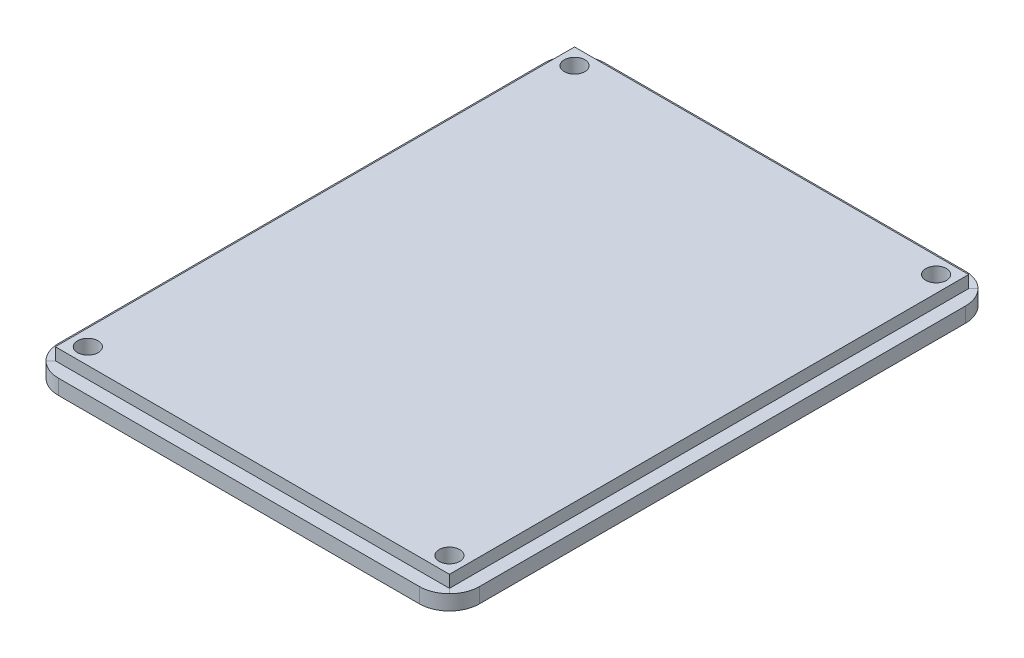
ISO-10303-21;
HEADER;
FILE_DESCRIPTION(('STEP AP214'),'2;1');
FILE_NAME('part.step','',(''),(''),'','','');
FILE_SCHEMA(('AUTOMOTIVE_DESIGN { 1 0 10303 214 1 1 1 1 }'));
ENDSEC;
DATA;
#1=APPLICATION_CONTEXT('core data for automotive mechanical design processes');
#2=APPLICATION_PROTOCOL_DEFINITION('international standard','automotive_design',2000,#1);
#3=PRODUCT_CONTEXT('',#1,'mechanical');
#4=PRODUCT('Part','Part','',(#3));
#5=PRODUCT_RELATED_PRODUCT_CATEGORY('part','',(#4));
#6=PRODUCT_DEFINITION_FORMATION('','',#4);
#7=PRODUCT_DEFINITION_CONTEXT('part definition',#1,'design');
#8=PRODUCT_DEFINITION('design','',#6,#7);
#9=PRODUCT_DEFINITION_SHAPE('','',#8);
#10=(LENGTH_UNIT() NAMED_UNIT(*) SI_UNIT(.MILLI.,.METRE.));
#11=(NAMED_UNIT(*) PLANE_ANGLE_UNIT() SI_UNIT($,.RADIAN.));
#12=(NAMED_UNIT(*) SI_UNIT($,.STERADIAN.) SOLID_ANGLE_UNIT());
#13=UNCERTAINTY_MEASURE_WITH_UNIT(LENGTH_MEASURE(1.E-05),#10,'distance_accuracy_value','');
#14=(GEOMETRIC_REPRESENTATION_CONTEXT(3) GLOBAL_UNCERTAINTY_ASSIGNED_CONTEXT((#13)) GLOBAL_UNIT_ASSIGNED_CONTEXT((#10,
#11,#12)) REPRESENTATION_CONTEXT('',''));
#15=CARTESIAN_POINT('',(0.,0.,0.));
#16=DIRECTION('',(0.,0.,1.));
#17=DIRECTION('',(1.,0.,0.));
#18=AXIS2_PLACEMENT_3D('',#15,#16,#17);
#19=CARTESIAN_POINT('',(34.115,-9.09999999999999,41.5));
#20=DIRECTION('',(0.,-1.,0.));
#21=DIRECTION('',(0.,0.,-1.));
#22=AXIS2_PLACEMENT_3D('',#19,#20,#21);
#23=PLANE('',#22);
#24=CARTESIAN_POINT('',(-28.8499999999999,-9.09999999999999,38.85));
#25=DIRECTION('',(0.,-1.,0.));
#26=DIRECTION('',(0.,0.,-1.));
#27=AXIS2_PLACEMENT_3D('',#24,#25,#26);
#28=CIRCLE('',#27,4.8);
#29=CARTESIAN_POINT('',(-28.8499999999999,-9.09999999999999,43.65));
#30=VERTEX_POINT('',#29);
#31=CARTESIAN_POINT('',(-32.2441125496954,-9.09999999999999,42.2441125496954));
#32=VERTEX_POINT('',#31);
#33=EDGE_CURVE('E332',#30,#32,#28,.T.);
#34=ORIENTED_EDGE('',*,*,#33,.F.);
#35=DIRECTION('',(-1.,0.,0.));
#36=VECTOR('',#35,1.);
#37=CARTESIAN_POINT('',(34.115,-9.09999999999999,43.65));
#38=LINE('',#37,#36);
#39=CARTESIAN_POINT('',(28.85,-9.09999999999999,43.65));
#40=VERTEX_POINT('',#39);
#41=EDGE_CURVE('E231',#40,#30,#38,.T.);
#42=ORIENTED_EDGE('',*,*,#41,.F.);
#43=CARTESIAN_POINT('',(28.85,-9.09999999999999,38.85));
#44=DIRECTION('',(0.,-1.,0.));
#45=DIRECTION('',(0.,0.,-1.));
#46=AXIS2_PLACEMENT_3D('',#43,#44,#45);
#47=CIRCLE('',#46,4.8);
#48=CARTESIAN_POINT('',(32.2441125496954,-9.09999999999999,42.2441125496954));
#49=VERTEX_POINT('',#48);
#50=EDGE_CURVE('E339',#49,#40,#47,.T.);
#51=ORIENTED_EDGE('',*,*,#50,.F.);
#52=DIRECTION('',(-0.707106781186548,0.,-0.707106781186548));
#53=VECTOR('',#52,1.);
#54=CARTESIAN_POINT('',(-11.3075,-9.09999999999999,-1.30749999999999));
#55=LINE('',#54,#53);
#56=CARTESIAN_POINT('',(31.5,-9.09999999999999,41.5));
#57=VERTEX_POINT('',#56);
#58=EDGE_CURVE('E378',#49,#57,#55,.T.);
#59=ORIENTED_EDGE('',*,*,#58,.T.);
#60=DIRECTION('',(-1.,0.,0.));
#61=VECTOR('',#60,1.);
#62=CARTESIAN_POINT('',(34.115,-9.09999999999999,41.5));
#63=LINE('',#62,#61);
#64=CARTESIAN_POINT('',(-31.5,-9.09999999999999,41.5));
#65=VERTEX_POINT('',#64);
#66=EDGE_CURVE('E243',#57,#65,#63,.T.);
#67=ORIENTED_EDGE('',*,*,#66,.T.);
#68=DIRECTION('',(0.707106781186547,0.,-0.707106781186548));
#69=VECTOR('',#68,1.);
#70=CARTESIAN_POINT('',(-32.8075,-9.09999999999999,42.8075));
#71=LINE('',#70,#69);
#72=EDGE_CURVE('E301',#32,#65,#71,.T.);
#73=ORIENTED_EDGE('',*,*,#72,.F.);
#74=EDGE_LOOP('',(#34,#42,#51,#59,#67,#73));
#75=FACE_BOUND('',#74,.T.);
#76=ADVANCED_FACE('F43',(#75),#23,.F.);
#77=CARTESIAN_POINT('',(34.115,-9.09999999999999,43.65));
#78=DIRECTION('',(0.,0.,-1.));
#79=DIRECTION('',(-1.,0.,0.));
#80=AXIS2_PLACEMENT_3D('',#77,#78,#79);
#81=PLANE('',#80);
#82=DIRECTION('',(0.,1.,0.));
#83=VECTOR('',#82,1.);
#84=CARTESIAN_POINT('',(-28.8499999999999,-11.5,43.65));
#85=LINE('',#84,#83);
#86=CARTESIAN_POINT('',(-28.8499999999999,-11.5,43.65));
#87=VERTEX_POINT('',#86);
#88=EDGE_CURVE('E214',#87,#30,#85,.T.);
#89=ORIENTED_EDGE('',*,*,#88,.F.);
#90=DIRECTION('',(-1.,0.,0.));
#91=VECTOR('',#90,1.);
#92=CARTESIAN_POINT('',(34.115,-11.5,43.65));
#93=LINE('',#92,#91);
#94=CARTESIAN_POINT('',(28.85,-11.5,43.65));
#95=VERTEX_POINT('',#94);
#96=EDGE_CURVE('E227',#95,#87,#93,.T.);
#97=ORIENTED_EDGE('',*,*,#96,.F.);
#98=DIRECTION('',(0.,1.,0.));
#99=VECTOR('',#98,1.);
#100=CARTESIAN_POINT('',(28.85,-11.5,43.65));
#101=LINE('',#100,#99);
#102=EDGE_CURVE('E235',#95,#40,#101,.T.);
#103=ORIENTED_EDGE('',*,*,#102,.T.);
#104=ORIENTED_EDGE('',*,*,#41,.T.);
#105=EDGE_LOOP('',(#89,#97,#103,#104));
#106=FACE_BOUND('',#105,.T.);
#107=ADVANCED_FACE('F230',(#106),#81,.F.);
#108=CARTESIAN_POINT('',(-31.5,-9.09999999999999,44.115));
#109=DIRECTION('',(0.,-1.,0.));
#110=DIRECTION('',(0.,0.,-1.));
#111=AXIS2_PLACEMENT_3D('',#108,#109,#110);
#112=PLANE('',#111);
#113=CARTESIAN_POINT('',(-28.8499999999999,-9.09999999999999,38.85));
#114=DIRECTION('',(0.,-1.,0.));
#115=DIRECTION('',(0.,0.,-1.));
#116=AXIS2_PLACEMENT_3D('',#113,#114,#115);
#117=CIRCLE('',#116,4.8);
#118=CARTESIAN_POINT('',(-33.6499999999999,-9.09999999999999,38.85));
#119=VERTEX_POINT('',#118);
#120=EDGE_CURVE('E337',#32,#119,#117,.T.);
#121=ORIENTED_EDGE('',*,*,#120,.F.);
#122=ORIENTED_EDGE('',*,*,#72,.T.);
#123=DIRECTION('',(0.,0.,-1.));
#124=VECTOR('',#123,1.);
#125=CARTESIAN_POINT('',(-31.5,-9.09999999999999,44.115));
#126=LINE('',#125,#124);
#127=CARTESIAN_POINT('',(-31.5,-9.09999999999999,0.));
#128=VERTEX_POINT('',#127);
#129=EDGE_CURVE('E315',#65,#128,#126,.T.);
#130=ORIENTED_EDGE('',*,*,#129,.T.);
#131=DIRECTION('',(-1.,0.,0.));
#132=VECTOR('',#131,1.);
#133=CARTESIAN_POINT('',(-31.5,-9.09999999999999,0.));
#134=LINE('',#133,#132);
#135=CARTESIAN_POINT('',(-33.65,-9.09999999999999,0.));
#136=VERTEX_POINT('',#135);
#137=EDGE_CURVE('E320',#128,#136,#134,.T.);
#138=ORIENTED_EDGE('',*,*,#137,.T.);
#139=DIRECTION('',(0.,0.,-1.));
#140=VECTOR('',#139,1.);
#141=CARTESIAN_POINT('',(-33.65,-9.09999999999999,44.115));
#142=LINE('',#141,#140);
#143=EDGE_CURVE('E244',#119,#136,#142,.T.);
#144=ORIENTED_EDGE('',*,*,#143,.F.);
#145=EDGE_LOOP('',(#121,#122,#130,#138,#144));
#146=FACE_BOUND('',#145,.T.);
#147=ADVANCED_FACE('F399',(#146),#112,.F.);
#148=CARTESIAN_POINT('',(-31.5,-9.09999999999999,0.));
#149=DIRECTION('',(0.,-1.,0.));
#150=DIRECTION('',(0.,0.,-1.));
#151=AXIS2_PLACEMENT_3D('',#148,#149,#150);
#152=PLANE('',#151);
#153=CARTESIAN_POINT('',(-28.85,-9.09999999999999,-38.85));
#154=DIRECTION('',(0.,-1.,0.));
#155=DIRECTION('',(0.,0.,-1.));
#156=AXIS2_PLACEMENT_3D('',#153,#154,#155);
#157=CIRCLE('',#156,4.79999999999999);
#158=CARTESIAN_POINT('',(-33.6499999999999,-9.09999999999999,-38.85));
#159=VERTEX_POINT('',#158);
#160=CARTESIAN_POINT('',(-32.2441125496954,-9.09999999999999,-42.2441125496954));
#161=VERTEX_POINT('',#160);
#162=EDGE_CURVE('E702',#159,#161,#157,.T.);
#163=ORIENTED_EDGE('',*,*,#162,.F.);
#164=DIRECTION('',(0.,0.,-1.));
#165=VECTOR('',#164,1.);
#166=CARTESIAN_POINT('',(-33.65,-9.09999999999999,0.));
#167=LINE('',#166,#165);
#168=EDGE_CURVE('E319',#136,#159,#167,.T.);
#169=ORIENTED_EDGE('',*,*,#168,.F.);
#170=ORIENTED_EDGE('',*,*,#137,.F.);
#171=DIRECTION('',(0.,0.,-1.));
#172=VECTOR('',#171,1.);
#173=CARTESIAN_POINT('',(-31.5,-9.09999999999999,0.));
#174=LINE('',#173,#172);
#175=CARTESIAN_POINT('',(-31.5,-9.09999999999999,-41.5));
#176=VERTEX_POINT('',#175);
#177=EDGE_CURVE('E304',#128,#176,#174,.T.);
#178=ORIENTED_EDGE('',*,*,#177,.T.);
#179=DIRECTION('',(0.707106781186548,0.,0.707106781186548));
#180=VECTOR('',#179,1.);
#181=CARTESIAN_POINT('',(-32.8075,-9.09999999999999,-42.8075));
#182=LINE('',#181,#180);
#183=EDGE_CURVE('E358',#161,#176,#182,.T.);
#184=ORIENTED_EDGE('',*,*,#183,.F.);
#185=EDGE_LOOP('',(#163,#169,#170,#178,#184));
#186=FACE_BOUND('',#185,.T.);
#187=ADVANCED_FACE('F605',(#186),#152,.F.);
#188=CARTESIAN_POINT('',(31.5,-9.09999999999999,-44.115));
#189=DIRECTION('',(0.,-1.,0.));
#190=DIRECTION('',(0.,0.,-1.));
#191=AXIS2_PLACEMENT_3D('',#188,#189,#190);
#192=PLANE('',#191);
#193=CARTESIAN_POINT('',(28.85,-9.09999999999999,-38.85));
#194=DIRECTION('',(0.,-1.,0.));
#195=DIRECTION('',(0.,0.,-1.));
#196=AXIS2_PLACEMENT_3D('',#193,#194,#195);
#197=CIRCLE('',#196,4.8);
#198=CARTESIAN_POINT('',(32.2441125496954,-9.09999999999999,-42.2441125496954));
#199=VERTEX_POINT('',#198);
#200=CARTESIAN_POINT('',(33.65,-9.09999999999999,-38.85));
#201=VERTEX_POINT('',#200);
#202=EDGE_CURVE('E715',#199,#201,#197,.T.);
#203=ORIENTED_EDGE('',*,*,#202,.F.);
#204=DIRECTION('',(-0.707106781186547,0.,0.707106781186548));
#205=VECTOR('',#204,1.);
#206=CARTESIAN_POINT('',(-1.30749999999997,-9.09999999999999,-8.69250000000001));
#207=LINE('',#206,#205);
#208=CARTESIAN_POINT('',(31.5,-9.09999999999999,-41.5));
#209=VERTEX_POINT('',#208);
#210=EDGE_CURVE('E345',#199,#209,#207,.T.);
#211=ORIENTED_EDGE('',*,*,#210,.T.);
#212=DIRECTION('',(0.,0.,1.));
#213=VECTOR('',#212,1.);
#214=CARTESIAN_POINT('',(31.5,-9.09999999999999,-44.115));
#215=LINE('',#214,#213);
#216=EDGE_CURVE('E381',#209,#57,#215,.T.);
#217=ORIENTED_EDGE('',*,*,#216,.T.);
#218=ORIENTED_EDGE('',*,*,#58,.F.);
#219=CARTESIAN_POINT('',(28.85,-9.09999999999999,38.85));
#220=DIRECTION('',(0.,-1.,0.));
#221=DIRECTION('',(0.,0.,-1.));
#222=AXIS2_PLACEMENT_3D('',#219,#220,#221);
#223=CIRCLE('',#222,4.8);
#224=CARTESIAN_POINT('',(33.65,-9.09999999999999,38.85));
#225=VERTEX_POINT('',#224);
#226=EDGE_CURVE('E410',#225,#49,#223,.T.);
#227=ORIENTED_EDGE('',*,*,#226,.F.);
#228=DIRECTION('',(0.,0.,1.));
#229=VECTOR('',#228,1.);
#230=CARTESIAN_POINT('',(33.65,-9.09999999999999,-44.115));
#231=LINE('',#230,#229);
#232=EDGE_CURVE('E385',#201,#225,#231,.T.);
#233=ORIENTED_EDGE('',*,*,#232,.F.);
#234=EDGE_LOOP('',(#203,#211,#217,#218,#227,#233));
#235=FACE_BOUND('',#234,.T.);
#236=ADVANCED_FACE('F411',(#235),#192,.F.);
#237=CARTESIAN_POINT('',(33.65,-9.09999999999999,-44.115));
#238=DIRECTION('',(-1.,0.,0.));
#239=DIRECTION('',(0.,0.,1.));
#240=AXIS2_PLACEMENT_3D('',#237,#238,#239);
#241=PLANE('',#240);
#242=DIRECTION('',(0.,1.,0.));
#243=VECTOR('',#242,1.);
#244=CARTESIAN_POINT('',(33.65,-11.5,38.85));
#245=LINE('',#244,#243);
#246=CARTESIAN_POINT('',(33.65,-11.5,38.85));
#247=VERTEX_POINT('',#246);
#248=EDGE_CURVE('E726',#247,#225,#245,.T.);
#249=ORIENTED_EDGE('',*,*,#248,.F.);
#250=DIRECTION('',(0.,0.,1.));
#251=VECTOR('',#250,1.);
#252=CARTESIAN_POINT('',(33.65,-11.5,-44.115));
#253=LINE('',#252,#251);
#254=CARTESIAN_POINT('',(33.65,-11.5,-38.85));
#255=VERTEX_POINT('',#254);
#256=EDGE_CURVE('E386',#255,#247,#253,.T.);
#257=ORIENTED_EDGE('',*,*,#256,.F.);
#258=DIRECTION('',(0.,1.,0.));
#259=VECTOR('',#258,1.);
#260=CARTESIAN_POINT('',(33.65,-11.5,-38.85));
#261=LINE('',#260,#259);
#262=EDGE_CURVE('E723',#255,#201,#261,.T.);
#263=ORIENTED_EDGE('',*,*,#262,.T.);
#264=ORIENTED_EDGE('',*,*,#232,.T.);
#265=EDGE_LOOP('',(#249,#257,#263,#264));
#266=FACE_BOUND('',#265,.T.);
#267=ADVANCED_FACE('F584',(#266),#241,.F.);
#268=CARTESIAN_POINT('',(-34.115,-9.09999999999999,-41.5));
#269=DIRECTION('',(0.,-1.,0.));
#270=DIRECTION('',(0.,0.,-1.));
#271=AXIS2_PLACEMENT_3D('',#268,#269,#270);
#272=PLANE('',#271);
#273=CARTESIAN_POINT('',(-28.85,-9.09999999999999,-38.85));
#274=DIRECTION('',(0.,-1.,0.));
#275=DIRECTION('',(0.,0.,-1.));
#276=AXIS2_PLACEMENT_3D('',#273,#274,#275);
#277=CIRCLE('',#276,4.79999999999999);
#278=CARTESIAN_POINT('',(-28.85,-9.09999999999999,-43.6499999999999));
#279=VERTEX_POINT('',#278);
#280=EDGE_CURVE('E704',#161,#279,#277,.T.);
#281=ORIENTED_EDGE('',*,*,#280,.F.);
#282=ORIENTED_EDGE('',*,*,#183,.T.);
#283=DIRECTION('',(1.,0.,0.));
#284=VECTOR('',#283,1.);
#285=CARTESIAN_POINT('',(-34.115,-9.09999999999999,-41.5));
#286=LINE('',#285,#284);
#287=EDGE_CURVE('E343',#176,#209,#286,.T.);
#288=ORIENTED_EDGE('',*,*,#287,.T.);
#289=ORIENTED_EDGE('',*,*,#210,.F.);
#290=CARTESIAN_POINT('',(28.85,-9.09999999999999,-38.85));
#291=DIRECTION('',(0.,-1.,0.));
#292=DIRECTION('',(0.,0.,-1.));
#293=AXIS2_PLACEMENT_3D('',#290,#291,#292);
#294=CIRCLE('',#293,4.8);
#295=CARTESIAN_POINT('',(28.85,-9.09999999999999,-43.65));
#296=VERTEX_POINT('',#295);
#297=EDGE_CURVE('E709',#296,#199,#294,.T.);
#298=ORIENTED_EDGE('',*,*,#297,.F.);
#299=DIRECTION('',(1.,0.,0.));
#300=VECTOR('',#299,1.);
#301=CARTESIAN_POINT('',(-34.115,-9.09999999999999,-43.65));
#302=LINE('',#301,#300);
#303=EDGE_CURVE('E262',#279,#296,#302,.T.);
#304=ORIENTED_EDGE('',*,*,#303,.F.);
#305=EDGE_LOOP('',(#281,#282,#288,#289,#298,#304));
#306=FACE_BOUND('',#305,.T.);
#307=ADVANCED_FACE('F422',(#306),#272,.F.);
#308=CARTESIAN_POINT('',(-34.115,-11.5,-43.65));
#309=DIRECTION('',(0.,1.,0.));
#310=DIRECTION('',(0.,0.,1.));
#311=AXIS2_PLACEMENT_3D('',#308,#309,#310);
#312=PLANE('',#311);
#313=DIRECTION('',(0.,0.,-1.));
#314=VECTOR('',#313,1.);
#315=CARTESIAN_POINT('',(-33.65,-11.5,0.));
#316=LINE('',#315,#314);
#317=CARTESIAN_POINT('',(-33.65,-11.5,0.));
#318=VERTEX_POINT('',#317);
#319=CARTESIAN_POINT('',(-33.6499999999999,-11.5,-38.85));
#320=VERTEX_POINT('',#319);
#321=EDGE_CURVE('E322',#318,#320,#316,.T.);
#322=ORIENTED_EDGE('',*,*,#321,.T.);
#323=CARTESIAN_POINT('',(-28.85,-11.5,-38.85));
#324=DIRECTION('',(0.,1.,0.));
#325=DIRECTION('',(0.,0.,1.));
#326=AXIS2_PLACEMENT_3D('',#323,#324,#325);
#327=CIRCLE('',#326,4.79999999999999);
#328=CARTESIAN_POINT('',(-32.2441125496954,-11.5,-42.2441125496954));
#329=VERTEX_POINT('',#328);
#330=EDGE_CURVE('E742',#329,#320,#327,.T.);
#331=ORIENTED_EDGE('',*,*,#330,.F.);
#332=CARTESIAN_POINT('',(-28.85,-11.5,-43.6499999999999));
#333=VERTEX_POINT('',#332);
#334=EDGE_CURVE('E232',#333,#329,#327,.T.);
#335=ORIENTED_EDGE('',*,*,#334,.F.);
#336=DIRECTION('',(1.,0.,0.));
#337=VECTOR('',#336,1.);
#338=CARTESIAN_POINT('',(-34.115,-11.5,-43.65));
#339=LINE('',#338,#337);
#340=CARTESIAN_POINT('',(28.85,-11.5,-43.6499999999999));
#341=VERTEX_POINT('',#340);
#342=EDGE_CURVE('E367',#333,#341,#339,.T.);
#343=ORIENTED_EDGE('',*,*,#342,.T.);
#344=CARTESIAN_POINT('',(28.85,-11.5,-38.85));
#345=DIRECTION('',(0.,1.,0.));
#346=DIRECTION('',(0.,0.,-1.));
#347=AXIS2_PLACEMENT_3D('',#344,#345,#346);
#348=CIRCLE('',#347,4.8);
#349=CARTESIAN_POINT('',(32.2441125496954,-11.5,-42.2441125496954));
#350=VERTEX_POINT('',#349);
#351=EDGE_CURVE('E745',#350,#341,#348,.T.);
#352=ORIENTED_EDGE('',*,*,#351,.F.);
#353=EDGE_CURVE('E740',#255,#350,#348,.T.);
#354=ORIENTED_EDGE('',*,*,#353,.F.);
#355=ORIENTED_EDGE('',*,*,#256,.T.);
#356=CARTESIAN_POINT('',(28.85,-11.5,38.85));
#357=DIRECTION('',(0.,1.,0.));
#358=DIRECTION('',(0.,0.,1.));
#359=AXIS2_PLACEMENT_3D('',#356,#357,#358);
#360=CIRCLE('',#359,4.8);
#361=CARTESIAN_POINT('',(32.2441125496954,-11.5,42.2441125496954));
#362=VERTEX_POINT('',#361);
#363=EDGE_CURVE('E734',#362,#247,#360,.T.);
#364=ORIENTED_EDGE('',*,*,#363,.F.);
#365=EDGE_CURVE('E236',#95,#362,#360,.T.);
#366=ORIENTED_EDGE('',*,*,#365,.F.);
#367=ORIENTED_EDGE('',*,*,#96,.T.);
#368=CARTESIAN_POINT('',(-28.8499999999999,-11.5,38.85));
#369=DIRECTION('',(0.,1.,0.));
#370=DIRECTION('',(0.,0.,1.));
#371=AXIS2_PLACEMENT_3D('',#368,#369,#370);
#372=CIRCLE('',#371,4.8);
#373=CARTESIAN_POINT('',(-32.2441125496954,-11.5,42.2441125496954));
#374=VERTEX_POINT('',#373);
#375=EDGE_CURVE('E212',#374,#87,#372,.T.);
#376=ORIENTED_EDGE('',*,*,#375,.F.);
#377=CARTESIAN_POINT('',(-33.6499999999999,-11.5,38.85));
#378=VERTEX_POINT('',#377);
#379=EDGE_CURVE('E216',#378,#374,#372,.T.);
#380=ORIENTED_EDGE('',*,*,#379,.F.);
#381=DIRECTION('',(0.,0.,-1.));
#382=VECTOR('',#381,1.);
#383=CARTESIAN_POINT('',(-33.65,-11.5,44.115));
#384=LINE('',#383,#382);
#385=EDGE_CURVE('E394',#378,#318,#384,.T.);
#386=ORIENTED_EDGE('',*,*,#385,.T.);
#387=EDGE_LOOP('',(#322,#331,#335,#343,#352,#354,#355,#364,#366,#367,#376,#380,#386));
#388=FACE_BOUND('',#387,.T.);
#389=CARTESIAN_POINT('',(-28.9,-11.5,38.9));
#390=DIRECTION('',(0.,1.,0.));
#391=DIRECTION('',(0.,0.,1.));
#392=AXIS2_PLACEMENT_3D('',#389,#390,#391);
#393=CIRCLE('',#392,3.65000000000003);
#394=CARTESIAN_POINT('',(-31.4809397513309,-11.5,41.4809397513309));
#395=VERTEX_POINT('',#394);
#396=EDGE_CURVE('E263',#395,#395,#393,.T.);
#397=ORIENTED_EDGE('',*,*,#396,.T.);
#398=EDGE_LOOP('',(#397));
#399=FACE_BOUND('',#398,.T.);
#400=CARTESIAN_POINT('',(28.9,-11.5,38.9));
#401=DIRECTION('',(0.,1.,0.));
#402=DIRECTION('',(0.,0.,1.));
#403=AXIS2_PLACEMENT_3D('',#400,#401,#402);
#404=CIRCLE('',#403,3.65);
#405=CARTESIAN_POINT('',(31.4809397513309,-11.5,41.4809397513309));
#406=VERTEX_POINT('',#405);
#407=EDGE_CURVE('E264',#406,#406,#404,.T.);
#408=ORIENTED_EDGE('',*,*,#407,.T.);
#409=EDGE_LOOP('',(#408));
#410=FACE_BOUND('',#409,.T.);
#411=CARTESIAN_POINT('',(28.9,-11.5,-38.9));
#412=DIRECTION('',(0.,1.,0.));
#413=DIRECTION('',(0.,0.,1.));
#414=AXIS2_PLACEMENT_3D('',#411,#412,#413);
#415=CIRCLE('',#414,3.65);
#416=CARTESIAN_POINT('',(31.4809397513309,-11.5,-41.4809397513309));
#417=VERTEX_POINT('',#416);
#418=EDGE_CURVE('E268',#417,#417,#415,.T.);
#419=ORIENTED_EDGE('',*,*,#418,.T.);
#420=EDGE_LOOP('',(#419));
#421=FACE_BOUND('',#420,.T.);
#422=CARTESIAN_POINT('',(-28.9,-11.5,-38.9));
#423=DIRECTION('',(0.,1.,0.));
#424=DIRECTION('',(0.,0.,1.));
#425=AXIS2_PLACEMENT_3D('',#422,#423,#424);
#426=CIRCLE('',#425,3.65000000000003);
#427=CARTESIAN_POINT('',(-31.4809397513309,-11.5,-41.4809397513309));
#428=VERTEX_POINT('',#427);
#429=EDGE_CURVE('E271',#428,#428,#426,.T.);
#430=ORIENTED_EDGE('',*,*,#429,.T.);
#431=EDGE_LOOP('',(#430));
#432=FACE_BOUND('',#431,.T.);
#433=ADVANCED_FACE('F240',(#388,#399,#410,#421,#432),#312,.F.);
#434=CARTESIAN_POINT('',(-34.115,-9.09999999999999,-43.65));
#435=DIRECTION('',(0.,0.,1.));
#436=DIRECTION('',(1.,0.,0.));
#437=AXIS2_PLACEMENT_3D('',#434,#435,#436);
#438=PLANE('',#437);
#439=DIRECTION('',(0.,1.,0.));
#440=VECTOR('',#439,1.);
#441=CARTESIAN_POINT('',(28.85,-11.5,-43.6499999999999));
#442=LINE('',#441,#440);
#443=EDGE_CURVE('E721',#341,#296,#442,.T.);
#444=ORIENTED_EDGE('',*,*,#443,.F.);
#445=ORIENTED_EDGE('',*,*,#342,.F.);
#446=DIRECTION('',(0.,1.,0.));
#447=VECTOR('',#446,1.);
#448=CARTESIAN_POINT('',(-28.85,-11.5,-43.6499999999999));
#449=LINE('',#448,#447);
#450=EDGE_CURVE('E714',#333,#279,#449,.T.);
#451=ORIENTED_EDGE('',*,*,#450,.T.);
#452=ORIENTED_EDGE('',*,*,#303,.T.);
#453=EDGE_LOOP('',(#444,#445,#451,#452));
#454=FACE_BOUND('',#453,.T.);
#455=ADVANCED_FACE('F507',(#454),#438,.F.);
#456=CARTESIAN_POINT('',(34.115,-7.14999999999999,41.5));
#457=DIRECTION('',(0.,0.,-1.));
#458=DIRECTION('',(-1.,0.,0.));
#459=AXIS2_PLACEMENT_3D('',#456,#457,#458);
#460=PLANE('',#459);
#461=ORIENTED_EDGE('',*,*,#66,.F.);
#462=DIRECTION('',(0.,1.,0.));
#463=VECTOR('',#462,1.);
#464=CARTESIAN_POINT('',(31.5,-7.14999999999999,41.5));
#465=LINE('',#464,#463);
#466=CARTESIAN_POINT('',(31.5,-7.14999999999999,41.5));
#467=VERTEX_POINT('',#466);
#468=EDGE_CURVE('E379',#57,#467,#465,.T.);
#469=ORIENTED_EDGE('',*,*,#468,.T.);
#470=DIRECTION('',(-1.,0.,0.));
#471=VECTOR('',#470,1.);
#472=CARTESIAN_POINT('',(34.115,-7.14999999999999,41.5));
#473=LINE('',#472,#471);
#474=CARTESIAN_POINT('',(-31.5,-7.14999999999999,41.5));
#475=VERTEX_POINT('',#474);
#476=EDGE_CURVE('E238',#467,#475,#473,.T.);
#477=ORIENTED_EDGE('',*,*,#476,.T.);
#478=DIRECTION('',(0.,1.,0.));
#479=VECTOR('',#478,1.);
#480=CARTESIAN_POINT('',(-31.5,-7.14999999999999,41.5));
#481=LINE('',#480,#479);
#482=EDGE_CURVE('E298',#65,#475,#481,.T.);
#483=ORIENTED_EDGE('',*,*,#482,.F.);
#484=EDGE_LOOP('',(#461,#469,#477,#483));
#485=FACE_BOUND('',#484,.T.);
#486=ADVANCED_FACE('F432',(#485),#460,.F.);
#487=CARTESIAN_POINT('',(-33.65,-9.09999999999999,44.115));
#488=DIRECTION('',(1.,0.,0.));
#489=DIRECTION('',(0.,0.,-1.));
#490=AXIS2_PLACEMENT_3D('',#487,#488,#489);
#491=PLANE('',#490);
#492=ORIENTED_EDGE('',*,*,#385,.F.);
#493=DIRECTION('',(0.,1.,0.));
#494=VECTOR('',#493,1.);
#495=CARTESIAN_POINT('',(-33.6499999999999,-11.5,38.85));
#496=LINE('',#495,#494);
#497=EDGE_CURVE('E710',#378,#119,#496,.T.);
#498=ORIENTED_EDGE('',*,*,#497,.T.);
#499=ORIENTED_EDGE('',*,*,#143,.T.);
#500=ORIENTED_EDGE('',*,*,#168,.T.);
#501=DIRECTION('',(0.,1.,0.));
#502=VECTOR('',#501,1.);
#503=CARTESIAN_POINT('',(-33.6499999999999,-11.5,-38.85));
#504=LINE('',#503,#502);
#505=EDGE_CURVE('E707',#320,#159,#504,.T.);
#506=ORIENTED_EDGE('',*,*,#505,.F.);
#507=ORIENTED_EDGE('',*,*,#321,.F.);
#508=EDGE_LOOP('',(#492,#498,#499,#500,#506,#507));
#509=FACE_BOUND('',#508,.T.);
#510=ADVANCED_FACE('F565',(#509),#491,.F.);
#511=CARTESIAN_POINT('',(-31.5,-7.14999999999999,44.115));
#512=DIRECTION('',(1.,0.,0.));
#513=DIRECTION('',(0.,0.,-1.));
#514=AXIS2_PLACEMENT_3D('',#511,#512,#513);
#515=PLANE('',#514);
#516=ORIENTED_EDGE('',*,*,#482,.T.);
#517=DIRECTION('',(0.,0.,-1.));
#518=VECTOR('',#517,1.);
#519=CARTESIAN_POINT('',(-31.5,-7.14999999999999,44.115));
#520=LINE('',#519,#518);
#521=CARTESIAN_POINT('',(-31.5,-7.14999999999999,0.));
#522=VERTEX_POINT('',#521);
#523=EDGE_CURVE('E296',#475,#522,#520,.T.);
#524=ORIENTED_EDGE('',*,*,#523,.T.);
#525=DIRECTION('',(0.,-1.,0.));
#526=VECTOR('',#525,1.);
#527=CARTESIAN_POINT('',(-31.5,-7.14999999999999,0.));
#528=LINE('',#527,#526);
#529=EDGE_CURVE('E312',#522,#128,#528,.T.);
#530=ORIENTED_EDGE('',*,*,#529,.T.);
#531=ORIENTED_EDGE('',*,*,#129,.F.);
#532=EDGE_LOOP('',(#516,#524,#530,#531));
#533=FACE_BOUND('',#532,.T.);
#534=ADVANCED_FACE('F435',(#533),#515,.F.);
#535=CARTESIAN_POINT('',(-31.5,-7.14999999999999,0.));
#536=DIRECTION('',(1.,0.,0.));
#537=DIRECTION('',(0.,0.,-1.));
#538=AXIS2_PLACEMENT_3D('',#535,#536,#537);
#539=PLANE('',#538);
#540=ORIENTED_EDGE('',*,*,#177,.F.);
#541=ORIENTED_EDGE('',*,*,#529,.F.);
#542=DIRECTION('',(0.,0.,-1.));
#543=VECTOR('',#542,1.);
#544=CARTESIAN_POINT('',(-31.5,-7.14999999999999,0.));
#545=LINE('',#544,#543);
#546=CARTESIAN_POINT('',(-31.5,-7.14999999999999,-41.5));
#547=VERTEX_POINT('',#546);
#548=EDGE_CURVE('E327',#522,#547,#545,.T.);
#549=ORIENTED_EDGE('',*,*,#548,.T.);
#550=DIRECTION('',(0.,1.,0.));
#551=VECTOR('',#550,1.);
#552=CARTESIAN_POINT('',(-31.5,-7.14999999999999,-41.5));
#553=LINE('',#552,#551);
#554=EDGE_CURVE('E354',#176,#547,#553,.T.);
#555=ORIENTED_EDGE('',*,*,#554,.F.);
#556=EDGE_LOOP('',(#540,#541,#549,#555));
#557=FACE_BOUND('',#556,.T.);
#558=ADVANCED_FACE('F437',(#557),#539,.F.);
#559=CARTESIAN_POINT('',(31.5,-7.14999999999999,-44.115));
#560=DIRECTION('',(-1.,0.,0.));
#561=DIRECTION('',(0.,0.,1.));
#562=AXIS2_PLACEMENT_3D('',#559,#560,#561);
#563=PLANE('',#562);
#564=ORIENTED_EDGE('',*,*,#216,.F.);
#565=DIRECTION('',(0.,1.,0.));
#566=VECTOR('',#565,1.);
#567=CARTESIAN_POINT('',(31.5,-7.14999999999999,-41.5));
#568=LINE('',#567,#566);
#569=CARTESIAN_POINT('',(31.5,-7.14999999999999,-41.5));
#570=VERTEX_POINT('',#569);
#571=EDGE_CURVE('E348',#209,#570,#568,.T.);
#572=ORIENTED_EDGE('',*,*,#571,.T.);
#573=DIRECTION('',(0.,0.,1.));
#574=VECTOR('',#573,1.);
#575=CARTESIAN_POINT('',(31.5,-7.14999999999999,-44.115));
#576=LINE('',#575,#574);
#577=EDGE_CURVE('E387',#570,#467,#576,.T.);
#578=ORIENTED_EDGE('',*,*,#577,.T.);
#579=ORIENTED_EDGE('',*,*,#468,.F.);
#580=EDGE_LOOP('',(#564,#572,#578,#579));
#581=FACE_BOUND('',#580,.T.);
#582=ADVANCED_FACE('F420',(#581),#563,.F.);
#583=CARTESIAN_POINT('',(-34.115,-7.14999999999999,-41.5));
#584=DIRECTION('',(0.,0.,1.));
#585=DIRECTION('',(1.,0.,0.));
#586=AXIS2_PLACEMENT_3D('',#583,#584,#585);
#587=PLANE('',#586);
#588=ORIENTED_EDGE('',*,*,#554,.T.);
#589=DIRECTION('',(1.,0.,0.));
#590=VECTOR('',#589,1.);
#591=CARTESIAN_POINT('',(-34.115,-7.14999999999999,-41.5));
#592=LINE('',#591,#590);
#593=EDGE_CURVE('E364',#547,#570,#592,.T.);
#594=ORIENTED_EDGE('',*,*,#593,.T.);
#595=ORIENTED_EDGE('',*,*,#571,.F.);
#596=ORIENTED_EDGE('',*,*,#287,.F.);
#597=EDGE_LOOP('',(#588,#594,#595,#596));
#598=FACE_BOUND('',#597,.T.);
#599=ADVANCED_FACE('F423',(#598),#587,.F.);
#600=CARTESIAN_POINT('',(-34.115,-7.14999999999999,-40.));
#601=DIRECTION('',(0.,-1.,0.));
#602=DIRECTION('',(0.,0.,-1.));
#603=AXIS2_PLACEMENT_3D('',#600,#601,#602);
#604=PLANE('',#603);
#605=ORIENTED_EDGE('',*,*,#593,.F.);
#606=ORIENTED_EDGE('',*,*,#548,.F.);
#607=ORIENTED_EDGE('',*,*,#523,.F.);
#608=ORIENTED_EDGE('',*,*,#476,.F.);
#609=ORIENTED_EDGE('',*,*,#577,.F.);
#610=EDGE_LOOP('',(#605,#606,#607,#608,#609));
#611=FACE_BOUND('',#610,.T.);
#612=CARTESIAN_POINT('',(28.9,-7.14999999999999,-38.9));
#613=DIRECTION('',(0.,-1.,0.));
#614=DIRECTION('',(0.,0.,-1.));
#615=AXIS2_PLACEMENT_3D('',#612,#613,#614);
#616=CIRCLE('',#615,1.65);
#617=CARTESIAN_POINT('',(30.0667261889578,-7.14999999999999,-40.0667261889578));
#618=VERTEX_POINT('',#617);
#619=EDGE_CURVE('E258',#618,#618,#616,.T.);
#620=ORIENTED_EDGE('',*,*,#619,.T.);
#621=EDGE_LOOP('',(#620));
#622=FACE_BOUND('',#621,.T.);
#623=CARTESIAN_POINT('',(28.9,-7.14999999999999,38.9));
#624=DIRECTION('',(0.,-1.,0.));
#625=DIRECTION('',(0.,0.,-1.));
#626=AXIS2_PLACEMENT_3D('',#623,#624,#625);
#627=CIRCLE('',#626,1.65);
#628=CARTESIAN_POINT('',(30.0667261889578,-7.14999999999999,40.0667261889578));
#629=VERTEX_POINT('',#628);
#630=EDGE_CURVE('E254',#629,#629,#627,.T.);
#631=ORIENTED_EDGE('',*,*,#630,.T.);
#632=EDGE_LOOP('',(#631));
#633=FACE_BOUND('',#632,.T.);
#634=CARTESIAN_POINT('',(-28.9,-7.14999999999999,38.9));
#635=DIRECTION('',(0.,-1.,0.));
#636=DIRECTION('',(0.,0.,-1.));
#637=AXIS2_PLACEMENT_3D('',#634,#635,#636);
#638=CIRCLE('',#637,1.65);
#639=CARTESIAN_POINT('',(-30.0667261889578,-7.14999999999999,40.0667261889578));
#640=VERTEX_POINT('',#639);
#641=EDGE_CURVE('E249',#640,#640,#638,.T.);
#642=ORIENTED_EDGE('',*,*,#641,.T.);
#643=EDGE_LOOP('',(#642));
#644=FACE_BOUND('',#643,.T.);
#645=CARTESIAN_POINT('',(-28.9,-7.14999999999999,-38.9));
#646=DIRECTION('',(0.,-1.,0.));
#647=DIRECTION('',(0.,0.,-1.));
#648=AXIS2_PLACEMENT_3D('',#645,#646,#647);
#649=CIRCLE('',#648,1.65);
#650=CARTESIAN_POINT('',(-30.0667261889578,-7.14999999999999,-40.0667261889578));
#651=VERTEX_POINT('',#650);
#652=EDGE_CURVE('E225',#651,#651,#649,.T.);
#653=ORIENTED_EDGE('',*,*,#652,.T.);
#654=EDGE_LOOP('',(#653));
#655=FACE_BOUND('',#654,.T.);
#656=ADVANCED_FACE('F294',(#611,#622,#633,#644,#655),#604,.F.);
#657=CARTESIAN_POINT('',(28.85,-11.5,-38.85));
#658=DIRECTION('',(0.,1.,0.));
#659=DIRECTION('',(0.,0.,1.));
#660=AXIS2_PLACEMENT_3D('',#657,#658,#659);
#661=CYLINDRICAL_SURFACE('',#660,4.8);
#662=ORIENTED_EDGE('',*,*,#202,.T.);
#663=ORIENTED_EDGE('',*,*,#262,.F.);
#664=ORIENTED_EDGE('',*,*,#353,.T.);
#665=ORIENTED_EDGE('',*,*,#351,.T.);
#666=ORIENTED_EDGE('',*,*,#443,.T.);
#667=ORIENTED_EDGE('',*,*,#297,.T.);
#668=EDGE_LOOP('',(#662,#663,#664,#665,#666,#667));
#669=FACE_BOUND('',#668,.T.);
#670=ADVANCED_FACE('F516',(#669),#661,.T.);
#671=CARTESIAN_POINT('',(-28.85,-11.5,-38.85));
#672=DIRECTION('',(0.,1.,0.));
#673=DIRECTION('',(0.,0.,1.));
#674=AXIS2_PLACEMENT_3D('',#671,#672,#673);
#675=CYLINDRICAL_SURFACE('',#674,4.79999999999999);
#676=ORIENTED_EDGE('',*,*,#162,.T.);
#677=ORIENTED_EDGE('',*,*,#280,.T.);
#678=ORIENTED_EDGE('',*,*,#450,.F.);
#679=ORIENTED_EDGE('',*,*,#334,.T.);
#680=ORIENTED_EDGE('',*,*,#330,.T.);
#681=ORIENTED_EDGE('',*,*,#505,.T.);
#682=EDGE_LOOP('',(#676,#677,#678,#679,#680,#681));
#683=FACE_BOUND('',#682,.T.);
#684=ADVANCED_FACE('F538',(#683),#675,.T.);
#685=CARTESIAN_POINT('',(28.85,-11.5,38.85));
#686=DIRECTION('',(0.,1.,0.));
#687=DIRECTION('',(0.,0.,1.));
#688=AXIS2_PLACEMENT_3D('',#685,#686,#687);
#689=CYLINDRICAL_SURFACE('',#688,4.8);
#690=ORIENTED_EDGE('',*,*,#50,.T.);
#691=ORIENTED_EDGE('',*,*,#102,.F.);
#692=ORIENTED_EDGE('',*,*,#365,.T.);
#693=ORIENTED_EDGE('',*,*,#363,.T.);
#694=ORIENTED_EDGE('',*,*,#248,.T.);
#695=ORIENTED_EDGE('',*,*,#226,.T.);
#696=EDGE_LOOP('',(#690,#691,#692,#693,#694,#695));
#697=FACE_BOUND('',#696,.T.);
#698=ADVANCED_FACE('F530',(#697),#689,.T.);
#699=CARTESIAN_POINT('',(-28.8499999999999,-11.5,38.85));
#700=DIRECTION('',(0.,1.,0.));
#701=DIRECTION('',(0.,0.,1.));
#702=AXIS2_PLACEMENT_3D('',#699,#700,#701);
#703=CYLINDRICAL_SURFACE('',#702,4.8);
#704=ORIENTED_EDGE('',*,*,#33,.T.);
#705=ORIENTED_EDGE('',*,*,#120,.T.);
#706=ORIENTED_EDGE('',*,*,#497,.F.);
#707=ORIENTED_EDGE('',*,*,#379,.T.);
#708=ORIENTED_EDGE('',*,*,#375,.T.);
#709=ORIENTED_EDGE('',*,*,#88,.T.);
#710=EDGE_LOOP('',(#704,#705,#706,#707,#708,#709));
#711=FACE_BOUND('',#710,.T.);
#712=ADVANCED_FACE('F215',(#711),#703,.T.);
#713=CARTESIAN_POINT('',(-28.9,-11.5,38.9));
#714=DIRECTION('',(0.,1.,0.));
#715=DIRECTION('',(0.,0.,1.));
#716=AXIS2_PLACEMENT_3D('',#713,#714,#715);
#717=CYLINDRICAL_SURFACE('',#716,1.65);
#718=CARTESIAN_POINT('',(-28.9,-9.49999999999996,38.9));
#719=DIRECTION('',(0.,1.,0.));
#720=DIRECTION('',(0.,0.,1.));
#721=AXIS2_PLACEMENT_3D('',#718,#719,#720);
#722=CIRCLE('',#721,1.65);
#723=CARTESIAN_POINT('',(-30.0667261889578,-9.49999999999996,40.0667261889578));
#724=VERTEX_POINT('',#723);
#725=EDGE_CURVE('E11',#724,#724,#722,.F.);
#726=ORIENTED_EDGE('',*,*,#725,.T.);
#727=EDGE_LOOP('',(#726));
#728=FACE_BOUND('',#727,.T.);
#729=ORIENTED_EDGE('',*,*,#641,.F.);
#730=EDGE_LOOP('',(#729));
#731=FACE_BOUND('',#730,.T.);
#732=ADVANCED_FACE('F283',(#728,#731),#717,.F.);
#733=CARTESIAN_POINT('',(28.9,-11.5,38.9));
#734=DIRECTION('',(0.,1.,0.));
#735=DIRECTION('',(0.,0.,1.));
#736=AXIS2_PLACEMENT_3D('',#733,#734,#735);
#737=CYLINDRICAL_SURFACE('',#736,1.65);
#738=CARTESIAN_POINT('',(28.9,-9.49999999999998,38.9));
#739=DIRECTION('',(0.,1.,0.));
#740=DIRECTION('',(0.,0.,1.));
#741=AXIS2_PLACEMENT_3D('',#738,#739,#740);
#742=CIRCLE('',#741,1.65);
#743=CARTESIAN_POINT('',(30.0667261889578,-9.49999999999998,40.0667261889578));
#744=VERTEX_POINT('',#743);
#745=EDGE_CURVE('E52',#744,#744,#742,.F.);
#746=ORIENTED_EDGE('',*,*,#745,.T.);
#747=EDGE_LOOP('',(#746));
#748=FACE_BOUND('',#747,.T.);
#749=ORIENTED_EDGE('',*,*,#630,.F.);
#750=EDGE_LOOP('',(#749));
#751=FACE_BOUND('',#750,.T.);
#752=ADVANCED_FACE('F290',(#748,#751),#737,.F.);
#753=CARTESIAN_POINT('',(28.9,-11.5,-38.9));
#754=DIRECTION('',(0.,1.,0.));
#755=DIRECTION('',(0.,0.,1.));
#756=AXIS2_PLACEMENT_3D('',#753,#754,#755);
#757=CYLINDRICAL_SURFACE('',#756,1.65);
#758=CARTESIAN_POINT('',(28.9,-9.49999999999998,-38.9));
#759=DIRECTION('',(0.,1.,0.));
#760=DIRECTION('',(0.,0.,1.));
#761=AXIS2_PLACEMENT_3D('',#758,#759,#760);
#762=CIRCLE('',#761,1.65);
#763=CARTESIAN_POINT('',(30.0667261889578,-9.49999999999998,-40.0667261889578));
#764=VERTEX_POINT('',#763);
#765=EDGE_CURVE('E280',#764,#764,#762,.F.);
#766=ORIENTED_EDGE('',*,*,#765,.T.);
#767=EDGE_LOOP('',(#766));
#768=FACE_BOUND('',#767,.T.);
#769=ORIENTED_EDGE('',*,*,#619,.F.);
#770=EDGE_LOOP('',(#769));
#771=FACE_BOUND('',#770,.T.);
#772=ADVANCED_FACE('F441',(#768,#771),#757,.F.);
#773=CARTESIAN_POINT('',(-28.9,-11.5,-38.9));
#774=DIRECTION('',(0.,1.,0.));
#775=DIRECTION('',(0.,0.,1.));
#776=AXIS2_PLACEMENT_3D('',#773,#774,#775);
#777=CYLINDRICAL_SURFACE('',#776,1.65);
#778=CARTESIAN_POINT('',(-28.9,-9.49999999999998,-38.9));
#779=DIRECTION('',(0.,1.,0.));
#780=DIRECTION('',(0.,0.,1.));
#781=AXIS2_PLACEMENT_3D('',#778,#779,#780);
#782=CIRCLE('',#781,1.65);
#783=CARTESIAN_POINT('',(-30.0667261889578,-9.49999999999998,-40.0667261889578));
#784=VERTEX_POINT('',#783);
#785=EDGE_CURVE('E272',#784,#784,#782,.F.);
#786=ORIENTED_EDGE('',*,*,#785,.T.);
#787=EDGE_LOOP('',(#786));
#788=FACE_BOUND('',#787,.T.);
#789=ORIENTED_EDGE('',*,*,#652,.F.);
#790=EDGE_LOOP('',(#789));
#791=FACE_BOUND('',#790,.T.);
#792=ADVANCED_FACE('F439',(#788,#791),#777,.F.);
#793=CARTESIAN_POINT('',(-28.9,-11.5,-38.9));
#794=DIRECTION('',(0.,-1.,0.));
#795=DIRECTION('',(0.,0.,-1.));
#796=AXIS2_PLACEMENT_3D('',#793,#794,#795);
#797=CONICAL_SURFACE('',#796,3.65000000000003,0.785398163397452);
#798=DIRECTION('',(-0.500000000000001,-0.707106781186545,-0.500000000000003));
#799=VECTOR('',#798,1.);
#800=CARTESIAN_POINT('',(-30.0667261889578,-9.49999999999998,-40.0667261889578));
#801=LINE('',#800,#799);
#802=EDGE_CURVE('E255',#784,#428,#801,.T.);
#803=ORIENTED_EDGE('',*,*,#802,.F.);
#804=ORIENTED_EDGE('',*,*,#785,.F.);
#805=ORIENTED_EDGE('',*,*,#802,.T.);
#806=ORIENTED_EDGE('',*,*,#429,.F.);
#807=EDGE_LOOP('',(#803,#804,#805,#806));
#808=FACE_BOUND('',#807,.T.);
#809=ADVANCED_FACE('F445',(#808),#797,.F.);
#810=CARTESIAN_POINT('',(28.9,-11.5,-38.9));
#811=DIRECTION('',(0.,-1.,0.));
#812=DIRECTION('',(0.,0.,-1.));
#813=AXIS2_PLACEMENT_3D('',#810,#811,#812);
#814=CONICAL_SURFACE('',#813,3.65,0.785398163397445);
#815=DIRECTION('',(0.5,-0.70710678118655,-0.499999999999997));
#816=VECTOR('',#815,1.);
#817=CARTESIAN_POINT('',(30.0667261889578,-9.49999999999998,-40.0667261889578));
#818=LINE('',#817,#816);
#819=EDGE_CURVE('E284',#764,#417,#818,.T.);
#820=ORIENTED_EDGE('',*,*,#819,.F.);
#821=ORIENTED_EDGE('',*,*,#765,.F.);
#822=ORIENTED_EDGE('',*,*,#819,.T.);
#823=ORIENTED_EDGE('',*,*,#418,.F.);
#824=EDGE_LOOP('',(#820,#821,#822,#823));
#825=FACE_BOUND('',#824,.T.);
#826=ADVANCED_FACE('F451',(#825),#814,.F.);
#827=CARTESIAN_POINT('',(28.9,-11.5,38.9));
#828=DIRECTION('',(0.,-1.,0.));
#829=DIRECTION('',(0.,0.,-1.));
#830=AXIS2_PLACEMENT_3D('',#827,#828,#829);
#831=CONICAL_SURFACE('',#830,3.65,0.785398163397447);
#832=DIRECTION('',(0.499999999999998,-0.707106781186548,0.500000000000001));
#833=VECTOR('',#832,1.);
#834=CARTESIAN_POINT('',(30.0667261889578,-9.49999999999998,40.0667261889578));
#835=LINE('',#834,#833);
#836=EDGE_CURVE('E70',#744,#406,#835,.T.);
#837=ORIENTED_EDGE('',*,*,#836,.F.);
#838=ORIENTED_EDGE('',*,*,#745,.F.);
#839=ORIENTED_EDGE('',*,*,#836,.T.);
#840=ORIENTED_EDGE('',*,*,#407,.F.);
#841=EDGE_LOOP('',(#837,#838,#839,#840));
#842=FACE_BOUND('',#841,.T.);
#843=ADVANCED_FACE('F471',(#842),#831,.F.);
#844=CARTESIAN_POINT('',(-28.9,-11.5,38.9));
#845=DIRECTION('',(0.,-1.,0.));
#846=DIRECTION('',(0.,0.,-1.));
#847=AXIS2_PLACEMENT_3D('',#844,#845,#846);
#848=CONICAL_SURFACE('',#847,3.65000000000003,0.78539816339745);
#849=DIRECTION('',(-0.5,-0.707106781186546,0.500000000000002));
#850=VECTOR('',#849,1.);
#851=CARTESIAN_POINT('',(-30.0667261889578,-9.49999999999996,40.0667261889578));
#852=LINE('',#851,#850);
#853=EDGE_CURVE('E48',#724,#395,#852,.T.);
#854=ORIENTED_EDGE('',*,*,#853,.F.);
#855=ORIENTED_EDGE('',*,*,#725,.F.);
#856=ORIENTED_EDGE('',*,*,#853,.T.);
#857=ORIENTED_EDGE('',*,*,#396,.F.);
#858=EDGE_LOOP('',(#854,#855,#856,#857));
#859=FACE_BOUND('',#858,.T.);
#860=ADVANCED_FACE('F46',(#859),#848,.F.);
#861=CLOSED_SHELL('',(#76,#107,#147,#187,#236,#267,#307,#433,#455,#486,#510,#534,#558,#582,#599,
#656,#670,#684,#698,#712,#732,#752,#772,#792,#809,#826,#843,#860));
#862=MANIFOLD_SOLID_BREP('B2',#861);
#863=ADVANCED_BREP_SHAPE_REPRESENTATION('',(#18,#862),#14);
#864=SHAPE_DEFINITION_REPRESENTATION(#9,#863);
ENDSEC;
END-ISO-10303-21;
